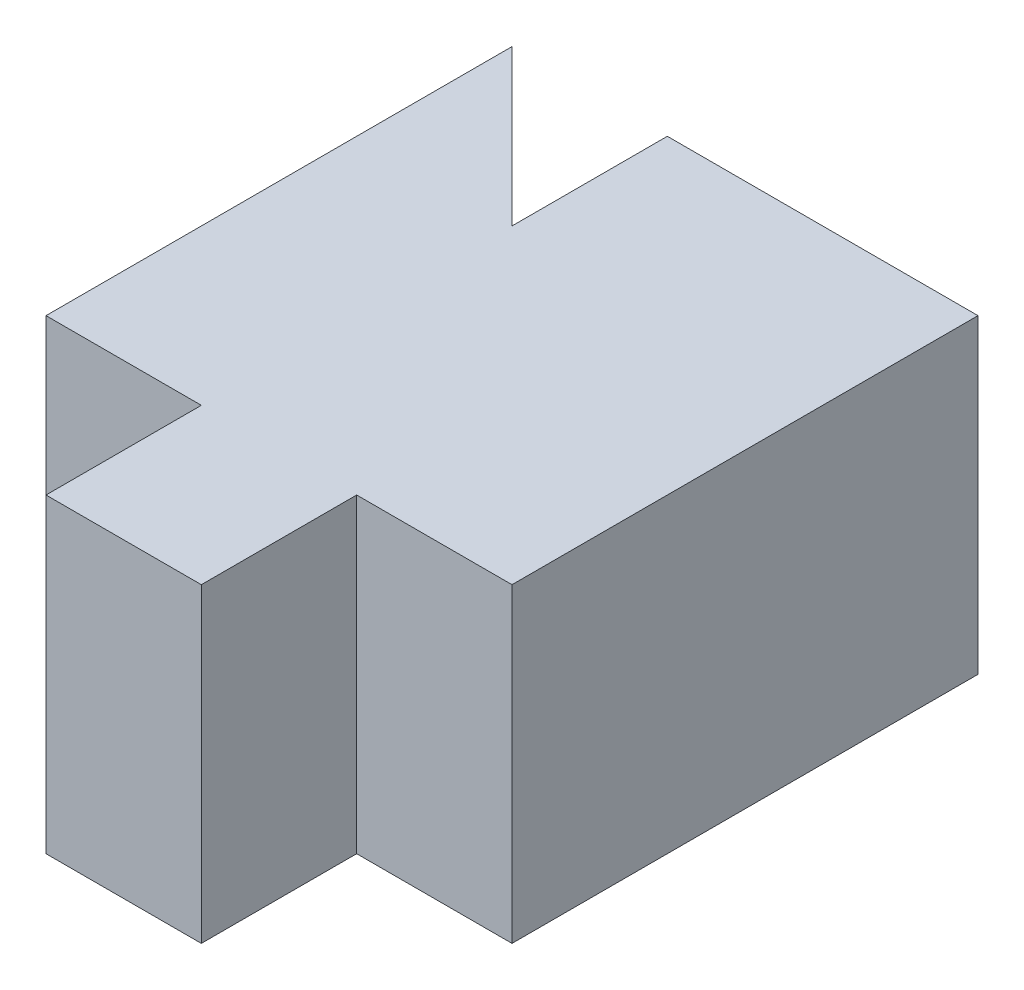
ISO-10303-21;
HEADER;
FILE_DESCRIPTION(('STEP AP214'),'2;1');
FILE_NAME('part.step','',(''),(''),'','','');
FILE_SCHEMA(('AUTOMOTIVE_DESIGN { 1 0 10303 214 1 1 1 1 }'));
ENDSEC;
DATA;
#1=APPLICATION_CONTEXT('core data for automotive mechanical design processes');
#2=APPLICATION_PROTOCOL_DEFINITION('international standard','automotive_design',2000,#1);
#3=PRODUCT_CONTEXT('',#1,'mechanical');
#4=PRODUCT('Part','Part','',(#3));
#5=PRODUCT_RELATED_PRODUCT_CATEGORY('part','',(#4));
#6=PRODUCT_DEFINITION_FORMATION('','',#4);
#7=PRODUCT_DEFINITION_CONTEXT('part definition',#1,'design');
#8=PRODUCT_DEFINITION('design','',#6,#7);
#9=PRODUCT_DEFINITION_SHAPE('','',#8);
#10=(LENGTH_UNIT() NAMED_UNIT(*) SI_UNIT(.MILLI.,.METRE.));
#11=(NAMED_UNIT(*) PLANE_ANGLE_UNIT() SI_UNIT($,.RADIAN.));
#12=(NAMED_UNIT(*) SI_UNIT($,.STERADIAN.) SOLID_ANGLE_UNIT());
#13=UNCERTAINTY_MEASURE_WITH_UNIT(LENGTH_MEASURE(1.E-05),#10,'distance_accuracy_value','');
#14=(GEOMETRIC_REPRESENTATION_CONTEXT(3) GLOBAL_UNCERTAINTY_ASSIGNED_CONTEXT((#13)) GLOBAL_UNIT_ASSIGNED_CONTEXT((#10,
#11,#12)) REPRESENTATION_CONTEXT('',''));
#15=CARTESIAN_POINT('',(0.,0.,0.));
#16=DIRECTION('',(0.,0.,1.));
#17=DIRECTION('',(1.,0.,0.));
#18=AXIS2_PLACEMENT_3D('',#15,#16,#17);
#19=CARTESIAN_POINT('',(2.5,10.,7.5));
#20=DIRECTION('',(0.,0.,-1.));
#21=DIRECTION('',(-1.,0.,0.));
#22=AXIS2_PLACEMENT_3D('',#19,#20,#21);
#23=PLANE('',#22);
#24=DIRECTION('',(1.,0.,0.));
#25=VECTOR('',#24,1.);
#26=CARTESIAN_POINT('',(2.5,0.,7.5));
#27=LINE('',#26,#25);
#28=CARTESIAN_POINT('',(2.5,0.,7.5));
#29=VERTEX_POINT('',#28);
#30=CARTESIAN_POINT('',(7.5,0.,7.5));
#31=VERTEX_POINT('',#30);
#32=EDGE_CURVE('E152',#29,#31,#27,.T.);
#33=ORIENTED_EDGE('',*,*,#32,.T.);
#34=DIRECTION('',(0.,-1.,0.));
#35=VECTOR('',#34,1.);
#36=CARTESIAN_POINT('',(7.5,10.,7.5));
#37=LINE('',#36,#35);
#38=CARTESIAN_POINT('',(7.5,10.,7.5));
#39=VERTEX_POINT('',#38);
#40=EDGE_CURVE('E11',#39,#31,#37,.T.);
#41=ORIENTED_EDGE('',*,*,#40,.F.);
#42=DIRECTION('',(1.,0.,0.));
#43=VECTOR('',#42,1.);
#44=CARTESIAN_POINT('',(2.5,10.,7.5));
#45=LINE('',#44,#43);
#46=CARTESIAN_POINT('',(2.5,10.,7.5));
#47=VERTEX_POINT('',#46);
#48=EDGE_CURVE('E180',#47,#39,#45,.T.);
#49=ORIENTED_EDGE('',*,*,#48,.F.);
#50=DIRECTION('',(0.,-1.,0.));
#51=VECTOR('',#50,1.);
#52=CARTESIAN_POINT('',(2.5,10.,7.5));
#53=LINE('',#52,#51);
#54=EDGE_CURVE('E148',#47,#29,#53,.T.);
#55=ORIENTED_EDGE('',*,*,#54,.T.);
#56=EDGE_LOOP('',(#33,#41,#49,#55));
#57=FACE_BOUND('',#56,.T.);
#58=ADVANCED_FACE('F39',(#57),#23,.F.);
#59=CARTESIAN_POINT('',(7.5,10.,-7.5));
#60=DIRECTION('',(-1.,0.,0.));
#61=DIRECTION('',(0.,0.,1.));
#62=AXIS2_PLACEMENT_3D('',#59,#60,#61);
#63=PLANE('',#62);
#64=DIRECTION('',(0.,0.,-1.));
#65=VECTOR('',#64,1.);
#66=CARTESIAN_POINT('',(7.5,0.,-7.5));
#67=LINE('',#66,#65);
#68=CARTESIAN_POINT('',(7.5,0.,-7.5));
#69=VERTEX_POINT('',#68);
#70=EDGE_CURVE('E156',#31,#69,#67,.T.);
#71=ORIENTED_EDGE('',*,*,#70,.T.);
#72=DIRECTION('',(0.,-1.,0.));
#73=VECTOR('',#72,1.);
#74=CARTESIAN_POINT('',(7.5,10.,-7.5));
#75=LINE('',#74,#73);
#76=CARTESIAN_POINT('',(7.5,10.,-7.5));
#77=VERTEX_POINT('',#76);
#78=EDGE_CURVE('E48',#77,#69,#75,.T.);
#79=ORIENTED_EDGE('',*,*,#78,.F.);
#80=DIRECTION('',(0.,0.,-1.));
#81=VECTOR('',#80,1.);
#82=CARTESIAN_POINT('',(7.5,10.,-7.5));
#83=LINE('',#82,#81);
#84=EDGE_CURVE('E105',#39,#77,#83,.T.);
#85=ORIENTED_EDGE('',*,*,#84,.F.);
#86=ORIENTED_EDGE('',*,*,#40,.T.);
#87=EDGE_LOOP('',(#71,#79,#85,#86));
#88=FACE_BOUND('',#87,.T.);
#89=ADVANCED_FACE('F244',(#88),#63,.F.);
#90=CARTESIAN_POINT('',(-2.5,10.,-7.5));
#91=DIRECTION('',(0.,0.,1.));
#92=DIRECTION('',(1.,0.,0.));
#93=AXIS2_PLACEMENT_3D('',#90,#91,#92);
#94=PLANE('',#93);
#95=DIRECTION('',(-1.,0.,0.));
#96=VECTOR('',#95,1.);
#97=CARTESIAN_POINT('',(-2.5,0.,-7.5));
#98=LINE('',#97,#96);
#99=CARTESIAN_POINT('',(-2.5,0.,-7.5));
#100=VERTEX_POINT('',#99);
#101=EDGE_CURVE('E159',#69,#100,#98,.T.);
#102=ORIENTED_EDGE('',*,*,#101,.T.);
#103=DIRECTION('',(0.,-1.,0.));
#104=VECTOR('',#103,1.);
#105=CARTESIAN_POINT('',(-2.5,10.,-7.5));
#106=LINE('',#105,#104);
#107=CARTESIAN_POINT('',(-2.5,10.,-7.5));
#108=VERTEX_POINT('',#107);
#109=EDGE_CURVE('E199',#108,#100,#106,.T.);
#110=ORIENTED_EDGE('',*,*,#109,.F.);
#111=DIRECTION('',(-1.,0.,0.));
#112=VECTOR('',#111,1.);
#113=CARTESIAN_POINT('',(-2.5,10.,-7.5));
#114=LINE('',#113,#112);
#115=EDGE_CURVE('E209',#77,#108,#114,.T.);
#116=ORIENTED_EDGE('',*,*,#115,.F.);
#117=ORIENTED_EDGE('',*,*,#78,.T.);
#118=EDGE_LOOP('',(#102,#110,#116,#117));
#119=FACE_BOUND('',#118,.T.);
#120=ADVANCED_FACE('F207',(#119),#94,.F.);
#121=CARTESIAN_POINT('',(-2.5,10.,-2.5));
#122=DIRECTION('',(1.,0.,0.));
#123=DIRECTION('',(0.,0.,-1.));
#124=AXIS2_PLACEMENT_3D('',#121,#122,#123);
#125=PLANE('',#124);
#126=DIRECTION('',(0.,0.,1.));
#127=VECTOR('',#126,1.);
#128=CARTESIAN_POINT('',(-2.5,0.,-2.5));
#129=LINE('',#128,#127);
#130=CARTESIAN_POINT('',(-2.5,0.,-2.5));
#131=VERTEX_POINT('',#130);
#132=EDGE_CURVE('E162',#100,#131,#129,.T.);
#133=ORIENTED_EDGE('',*,*,#132,.T.);
#134=DIRECTION('',(0.,-1.,0.));
#135=VECTOR('',#134,1.);
#136=CARTESIAN_POINT('',(-2.5,10.,-2.5));
#137=LINE('',#136,#135);
#138=CARTESIAN_POINT('',(-2.5,10.,-2.5));
#139=VERTEX_POINT('',#138);
#140=EDGE_CURVE('E195',#139,#131,#137,.T.);
#141=ORIENTED_EDGE('',*,*,#140,.F.);
#142=DIRECTION('',(0.,0.,1.));
#143=VECTOR('',#142,1.);
#144=CARTESIAN_POINT('',(-2.5,10.,-2.5));
#145=LINE('',#144,#143);
#146=EDGE_CURVE('E228',#108,#139,#145,.T.);
#147=ORIENTED_EDGE('',*,*,#146,.F.);
#148=ORIENTED_EDGE('',*,*,#109,.T.);
#149=EDGE_LOOP('',(#133,#141,#147,#148));
#150=FACE_BOUND('',#149,.T.);
#151=ADVANCED_FACE('F218',(#150),#125,.F.);
#152=CARTESIAN_POINT('',(-7.5,10.,-7.5));
#153=DIRECTION('',(-0.707106781186547,0.,0.707106781186548));
#154=DIRECTION('',(0.707106781186548,0.,0.707106781186547));
#155=AXIS2_PLACEMENT_3D('',#152,#153,#154);
#156=PLANE('',#155);
#157=DIRECTION('',(-0.707106781186548,0.,-0.707106781186547));
#158=VECTOR('',#157,1.);
#159=CARTESIAN_POINT('',(-7.5,0.,-7.5));
#160=LINE('',#159,#158);
#161=CARTESIAN_POINT('',(-7.5,0.,-7.5));
#162=VERTEX_POINT('',#161);
#163=EDGE_CURVE('E165',#131,#162,#160,.T.);
#164=ORIENTED_EDGE('',*,*,#163,.T.);
#165=DIRECTION('',(0.,-1.,0.));
#166=VECTOR('',#165,1.);
#167=CARTESIAN_POINT('',(-7.5,10.,-7.5));
#168=LINE('',#167,#166);
#169=CARTESIAN_POINT('',(-7.5,10.,-7.5));
#170=VERTEX_POINT('',#169);
#171=EDGE_CURVE('E191',#170,#162,#168,.T.);
#172=ORIENTED_EDGE('',*,*,#171,.F.);
#173=DIRECTION('',(-0.707106781186548,0.,-0.707106781186547));
#174=VECTOR('',#173,1.);
#175=CARTESIAN_POINT('',(-7.5,10.,-7.5));
#176=LINE('',#175,#174);
#177=EDGE_CURVE('E224',#139,#170,#176,.T.);
#178=ORIENTED_EDGE('',*,*,#177,.F.);
#179=ORIENTED_EDGE('',*,*,#140,.T.);
#180=EDGE_LOOP('',(#164,#172,#178,#179));
#181=FACE_BOUND('',#180,.T.);
#182=ADVANCED_FACE('F222',(#181),#156,.F.);
#183=CARTESIAN_POINT('',(-7.5,10.,-7.5));
#184=DIRECTION('',(1.,0.,0.));
#185=DIRECTION('',(0.,0.,-1.));
#186=AXIS2_PLACEMENT_3D('',#183,#184,#185);
#187=PLANE('',#186);
#188=DIRECTION('',(0.,0.,1.));
#189=VECTOR('',#188,1.);
#190=CARTESIAN_POINT('',(-7.5,0.,-7.5));
#191=LINE('',#190,#189);
#192=CARTESIAN_POINT('',(-7.5,0.,7.5));
#193=VERTEX_POINT('',#192);
#194=EDGE_CURVE('E168',#162,#193,#191,.T.);
#195=ORIENTED_EDGE('',*,*,#194,.T.);
#196=DIRECTION('',(0.,-1.,0.));
#197=VECTOR('',#196,1.);
#198=CARTESIAN_POINT('',(-7.5,10.,7.5));
#199=LINE('',#198,#197);
#200=CARTESIAN_POINT('',(-7.5,10.,7.5));
#201=VERTEX_POINT('',#200);
#202=EDGE_CURVE('E187',#201,#193,#199,.T.);
#203=ORIENTED_EDGE('',*,*,#202,.F.);
#204=DIRECTION('',(0.,0.,1.));
#205=VECTOR('',#204,1.);
#206=CARTESIAN_POINT('',(-7.5,10.,-7.5));
#207=LINE('',#206,#205);
#208=EDGE_CURVE('E227',#170,#201,#207,.T.);
#209=ORIENTED_EDGE('',*,*,#208,.F.);
#210=ORIENTED_EDGE('',*,*,#171,.T.);
#211=EDGE_LOOP('',(#195,#203,#209,#210));
#212=FACE_BOUND('',#211,.T.);
#213=ADVANCED_FACE('F256',(#212),#187,.F.);
#214=CARTESIAN_POINT('',(-7.5,10.,7.5));
#215=DIRECTION('',(0.,0.,-1.));
#216=DIRECTION('',(-1.,0.,0.));
#217=AXIS2_PLACEMENT_3D('',#214,#215,#216);
#218=PLANE('',#217);
#219=DIRECTION('',(1.,0.,0.));
#220=VECTOR('',#219,1.);
#221=CARTESIAN_POINT('',(-7.5,0.,7.5));
#222=LINE('',#221,#220);
#223=CARTESIAN_POINT('',(-2.5,0.,7.5));
#224=VERTEX_POINT('',#223);
#225=EDGE_CURVE('E171',#193,#224,#222,.T.);
#226=ORIENTED_EDGE('',*,*,#225,.T.);
#227=DIRECTION('',(0.,-1.,0.));
#228=VECTOR('',#227,1.);
#229=CARTESIAN_POINT('',(-2.5,10.,7.5));
#230=LINE('',#229,#228);
#231=CARTESIAN_POINT('',(-2.5,10.,7.5));
#232=VERTEX_POINT('',#231);
#233=EDGE_CURVE('E141',#232,#224,#230,.T.);
#234=ORIENTED_EDGE('',*,*,#233,.F.);
#235=DIRECTION('',(1.,0.,0.));
#236=VECTOR('',#235,1.);
#237=CARTESIAN_POINT('',(-7.5,10.,7.5));
#238=LINE('',#237,#236);
#239=EDGE_CURVE('E130',#201,#232,#238,.T.);
#240=ORIENTED_EDGE('',*,*,#239,.F.);
#241=ORIENTED_EDGE('',*,*,#202,.T.);
#242=EDGE_LOOP('',(#226,#234,#240,#241));
#243=FACE_BOUND('',#242,.T.);
#244=ADVANCED_FACE('F259',(#243),#218,.F.);
#245=CARTESIAN_POINT('',(-2.5,10.,7.5));
#246=DIRECTION('',(1.,0.,0.));
#247=DIRECTION('',(0.,0.,-1.));
#248=AXIS2_PLACEMENT_3D('',#245,#246,#247);
#249=PLANE('',#248);
#250=DIRECTION('',(0.,0.,1.));
#251=VECTOR('',#250,1.);
#252=CARTESIAN_POINT('',(-2.5,0.,7.5));
#253=LINE('',#252,#251);
#254=CARTESIAN_POINT('',(-2.5,0.,12.5));
#255=VERTEX_POINT('',#254);
#256=EDGE_CURVE('E139',#224,#255,#253,.T.);
#257=ORIENTED_EDGE('',*,*,#256,.T.);
#258=DIRECTION('',(0.,-1.,0.));
#259=VECTOR('',#258,1.);
#260=CARTESIAN_POINT('',(-2.5,10.,12.5));
#261=LINE('',#260,#259);
#262=CARTESIAN_POINT('',(-2.5,10.,12.5));
#263=VERTEX_POINT('',#262);
#264=EDGE_CURVE('E136',#263,#255,#261,.T.);
#265=ORIENTED_EDGE('',*,*,#264,.F.);
#266=DIRECTION('',(0.,0.,1.));
#267=VECTOR('',#266,1.);
#268=CARTESIAN_POINT('',(-2.5,10.,7.5));
#269=LINE('',#268,#267);
#270=EDGE_CURVE('E124',#232,#263,#269,.T.);
#271=ORIENTED_EDGE('',*,*,#270,.F.);
#272=ORIENTED_EDGE('',*,*,#233,.T.);
#273=EDGE_LOOP('',(#257,#265,#271,#272));
#274=FACE_BOUND('',#273,.T.);
#275=ADVANCED_FACE('F137',(#274),#249,.F.);
#276=CARTESIAN_POINT('',(-2.5,10.,12.5));
#277=DIRECTION('',(0.,0.,-1.));
#278=DIRECTION('',(-1.,0.,0.));
#279=AXIS2_PLACEMENT_3D('',#276,#277,#278);
#280=PLANE('',#279);
#281=DIRECTION('',(1.,0.,0.));
#282=VECTOR('',#281,1.);
#283=CARTESIAN_POINT('',(-2.5,0.,12.5));
#284=LINE('',#283,#282);
#285=CARTESIAN_POINT('',(2.5,0.,12.5));
#286=VERTEX_POINT('',#285);
#287=EDGE_CURVE('E91',#255,#286,#284,.T.);
#288=ORIENTED_EDGE('',*,*,#287,.T.);
#289=DIRECTION('',(0.,-1.,0.));
#290=VECTOR('',#289,1.);
#291=CARTESIAN_POINT('',(2.5,10.,12.5));
#292=LINE('',#291,#290);
#293=CARTESIAN_POINT('',(2.5,10.,12.5));
#294=VERTEX_POINT('',#293);
#295=EDGE_CURVE('E142',#294,#286,#292,.T.);
#296=ORIENTED_EDGE('',*,*,#295,.F.);
#297=DIRECTION('',(1.,0.,0.));
#298=VECTOR('',#297,1.);
#299=CARTESIAN_POINT('',(-2.5,10.,12.5));
#300=LINE('',#299,#298);
#301=EDGE_CURVE('E128',#263,#294,#300,.T.);
#302=ORIENTED_EDGE('',*,*,#301,.F.);
#303=ORIENTED_EDGE('',*,*,#264,.T.);
#304=EDGE_LOOP('',(#288,#296,#302,#303));
#305=FACE_BOUND('',#304,.T.);
#306=ADVANCED_FACE('F144',(#305),#280,.F.);
#307=CARTESIAN_POINT('',(2.5,10.,7.5));
#308=DIRECTION('',(-1.,0.,0.));
#309=DIRECTION('',(0.,0.,1.));
#310=AXIS2_PLACEMENT_3D('',#307,#308,#309);
#311=PLANE('',#310);
#312=DIRECTION('',(0.,0.,-1.));
#313=VECTOR('',#312,1.);
#314=CARTESIAN_POINT('',(2.5,0.,7.5));
#315=LINE('',#314,#313);
#316=EDGE_CURVE('E97',#286,#29,#315,.T.);
#317=ORIENTED_EDGE('',*,*,#316,.T.);
#318=ORIENTED_EDGE('',*,*,#54,.F.);
#319=DIRECTION('',(0.,0.,-1.));
#320=VECTOR('',#319,1.);
#321=CARTESIAN_POINT('',(2.5,10.,7.5));
#322=LINE('',#321,#320);
#323=EDGE_CURVE('E56',#294,#47,#322,.T.);
#324=ORIENTED_EDGE('',*,*,#323,.F.);
#325=ORIENTED_EDGE('',*,*,#295,.T.);
#326=EDGE_LOOP('',(#317,#318,#324,#325));
#327=FACE_BOUND('',#326,.T.);
#328=ADVANCED_FACE('F268',(#327),#311,.F.);
#329=CARTESIAN_POINT('',(0.,10.,0.));
#330=DIRECTION('',(0.,-1.,0.));
#331=DIRECTION('',(0.,0.,-1.));
#332=AXIS2_PLACEMENT_3D('',#329,#330,#331);
#333=PLANE('',#332);
#334=ORIENTED_EDGE('',*,*,#48,.T.);
#335=ORIENTED_EDGE('',*,*,#84,.T.);
#336=ORIENTED_EDGE('',*,*,#115,.T.);
#337=ORIENTED_EDGE('',*,*,#146,.T.);
#338=ORIENTED_EDGE('',*,*,#177,.T.);
#339=ORIENTED_EDGE('',*,*,#208,.T.);
#340=ORIENTED_EDGE('',*,*,#239,.T.);
#341=ORIENTED_EDGE('',*,*,#270,.T.);
#342=ORIENTED_EDGE('',*,*,#301,.T.);
#343=ORIENTED_EDGE('',*,*,#323,.T.);
#344=EDGE_LOOP('',(#334,#335,#336,#337,#338,#339,#340,#341,#342,#343));
#345=FACE_BOUND('',#344,.T.);
#346=ADVANCED_FACE('F126',(#345),#333,.F.);
#347=CARTESIAN_POINT('',(0.,0.,0.));
#348=DIRECTION('',(0.,-1.,0.));
#349=DIRECTION('',(0.,0.,-1.));
#350=AXIS2_PLACEMENT_3D('',#347,#348,#349);
#351=PLANE('',#350);
#352=ORIENTED_EDGE('',*,*,#32,.F.);
#353=ORIENTED_EDGE('',*,*,#316,.F.);
#354=ORIENTED_EDGE('',*,*,#287,.F.);
#355=ORIENTED_EDGE('',*,*,#256,.F.);
#356=ORIENTED_EDGE('',*,*,#225,.F.);
#357=ORIENTED_EDGE('',*,*,#194,.F.);
#358=ORIENTED_EDGE('',*,*,#163,.F.);
#359=ORIENTED_EDGE('',*,*,#132,.F.);
#360=ORIENTED_EDGE('',*,*,#101,.F.);
#361=ORIENTED_EDGE('',*,*,#70,.F.);
#362=EDGE_LOOP('',(#352,#353,#354,#355,#356,#357,#358,#359,#360,#361));
#363=FACE_BOUND('',#362,.T.);
#364=ADVANCED_FACE('F213',(#363),#351,.T.);
#365=CLOSED_SHELL('',(#58,#89,#120,#151,#182,#213,#244,#275,#306,#328,#346,#364));
#366=MANIFOLD_SOLID_BREP('B2',#365);
#367=ADVANCED_BREP_SHAPE_REPRESENTATION('',(#18,#366),#14);
#368=SHAPE_DEFINITION_REPRESENTATION(#9,#367);
ENDSEC;
END-ISO-10303-21;
